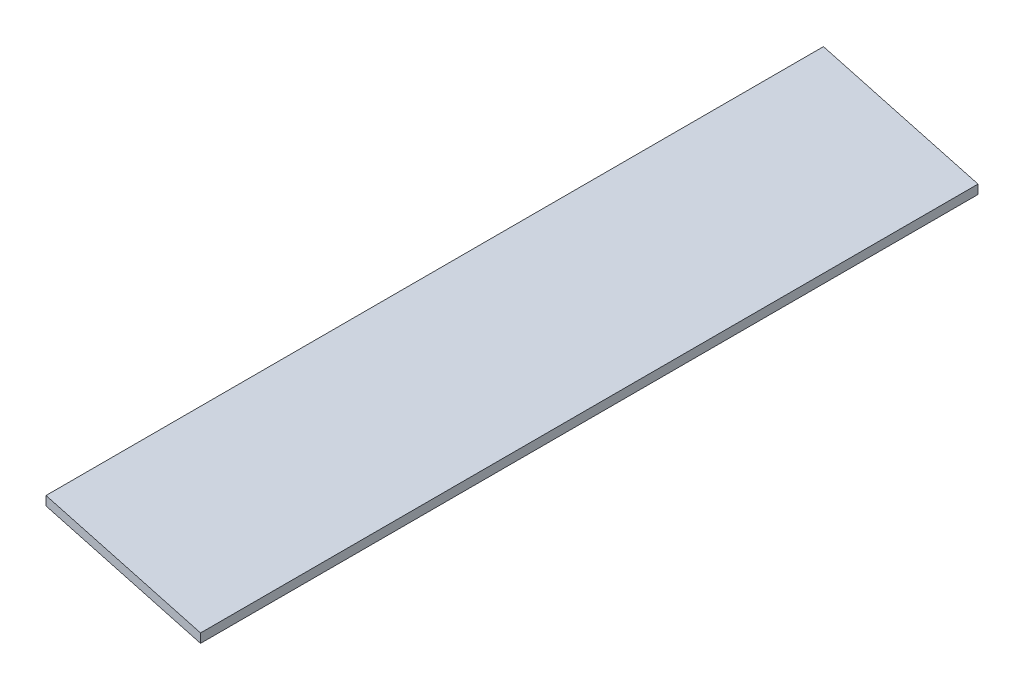
ISO-10303-21;
HEADER;
FILE_DESCRIPTION(('STEP AP214'),'2;1');
FILE_NAME('part.step','',(''),(''),'','','');
FILE_SCHEMA(('AUTOMOTIVE_DESIGN { 1 0 10303 214 1 1 1 1 }'));
ENDSEC;
DATA;
#1=APPLICATION_CONTEXT('core data for automotive mechanical design processes');
#2=APPLICATION_PROTOCOL_DEFINITION('international standard','automotive_design',2000,#1);
#3=PRODUCT_CONTEXT('',#1,'mechanical');
#4=PRODUCT('Part','Part','',(#3));
#5=PRODUCT_RELATED_PRODUCT_CATEGORY('part','',(#4));
#6=PRODUCT_DEFINITION_FORMATION('','',#4);
#7=PRODUCT_DEFINITION_CONTEXT('part definition',#1,'design');
#8=PRODUCT_DEFINITION('design','',#6,#7);
#9=PRODUCT_DEFINITION_SHAPE('','',#8);
#10=(LENGTH_UNIT() NAMED_UNIT(*) SI_UNIT(.MILLI.,.METRE.));
#11=(NAMED_UNIT(*) PLANE_ANGLE_UNIT() SI_UNIT($,.RADIAN.));
#12=(NAMED_UNIT(*) SI_UNIT($,.STERADIAN.) SOLID_ANGLE_UNIT());
#13=UNCERTAINTY_MEASURE_WITH_UNIT(LENGTH_MEASURE(1.E-05),#10,'distance_accuracy_value','');
#14=(GEOMETRIC_REPRESENTATION_CONTEXT(3) GLOBAL_UNCERTAINTY_ASSIGNED_CONTEXT((#13)) GLOBAL_UNIT_ASSIGNED_CONTEXT((#10,
#11,#12)) REPRESENTATION_CONTEXT('',''));
#15=CARTESIAN_POINT('',(0.,0.,0.));
#16=DIRECTION('',(0.,0.,1.));
#17=DIRECTION('',(1.,0.,0.));
#18=AXIS2_PLACEMENT_3D('',#15,#16,#17);
#19=CARTESIAN_POINT('',(-8.631267976045,2.15,0.));
#20=DIRECTION('',(0.,1.,0.));
#21=DIRECTION('',(0.,0.,1.));
#22=AXIS2_PLACEMENT_3D('',#19,#20,#21);
#23=PLANE('',#22);
#24=DIRECTION('',(-0.978119374932536,0.,-0.208044438477901));
#25=VECTOR('',#24,1.);
#26=CARTESIAN_POINT('',(-7.732346536976,2.15,-4.226272437417));
#27=LINE('',#26,#25);
#28=CARTESIAN_POINT('',(1.87710031867289,2.15,-2.18235834431049));
#29=VERTEX_POINT('',#28);
#30=CARTESIAN_POINT('',(1.66005915992088,2.15,-2.22852265426745));
#31=VERTEX_POINT('',#30);
#32=EDGE_CURVE('E79',#29,#31,#27,.T.);
#33=ORIENTED_EDGE('',*,*,#32,.F.);
#34=DIRECTION('',(0.,0.,-1.));
#35=VECTOR('',#34,1.);
#36=CARTESIAN_POINT('',(1.877100318673,2.15,0.));
#37=LINE('',#36,#35);
#38=CARTESIAN_POINT('',(1.87710031867286,2.15,-1.32280645369934));
#39=VERTEX_POINT('',#38);
#40=EDGE_CURVE('E55',#39,#29,#37,.T.);
#41=ORIENTED_EDGE('',*,*,#40,.F.);
#42=DIRECTION('',(0.978119374932536,0.,0.208044438477901));
#43=VECTOR('',#42,1.);
#44=CARTESIAN_POINT('',(-7.907258724832,2.15,-3.403924091524));
#45=LINE('',#44,#43);
#46=CARTESIAN_POINT('',(1.6600591599209,2.15,-1.36897076365554));
#47=VERTEX_POINT('',#46);
#48=EDGE_CURVE('E57',#47,#39,#45,.T.);
#49=ORIENTED_EDGE('',*,*,#48,.F.);
#50=DIRECTION('',(0.,0.,1.));
#51=VECTOR('',#50,1.);
#52=CARTESIAN_POINT('',(1.660059159921,2.15,0.));
#53=LINE('',#52,#51);
#54=EDGE_CURVE('E20',#31,#47,#53,.T.);
#55=ORIENTED_EDGE('',*,*,#54,.F.);
#56=EDGE_LOOP('',(#33,#41,#49,#55));
#57=FACE_BOUND('',#56,.T.);
#58=ADVANCED_FACE('F17',(#57),#23,.F.);
#59=CARTESIAN_POINT('',(1.660059159921,2.16,0.));
#60=DIRECTION('',(-1.,0.,0.));
#61=DIRECTION('',(0.,0.,1.));
#62=AXIS2_PLACEMENT_3D('',#59,#60,#61);
#63=PLANE('',#62);
#64=DIRECTION('',(0.,0.,1.));
#65=VECTOR('',#64,1.);
#66=CARTESIAN_POINT('',(1.660059159921,2.16,0.));
#67=LINE('',#66,#65);
#68=CARTESIAN_POINT('',(1.66005915992088,2.16,-2.22852265426745));
#69=VERTEX_POINT('',#68);
#70=CARTESIAN_POINT('',(1.6600591599209,2.16,-1.36897076365554));
#71=VERTEX_POINT('',#70);
#72=EDGE_CURVE('E83',#69,#71,#67,.T.);
#73=ORIENTED_EDGE('',*,*,#72,.F.);
#74=DIRECTION('',(0.,1.,0.));
#75=VECTOR('',#74,1.);
#76=CARTESIAN_POINT('',(1.66005915992053,2.16,-2.22852265426578));
#77=LINE('',#76,#75);
#78=EDGE_CURVE('E68',#31,#69,#77,.T.);
#79=ORIENTED_EDGE('',*,*,#78,.F.);
#80=ORIENTED_EDGE('',*,*,#54,.T.);
#81=DIRECTION('',(0.,1.,0.));
#82=VECTOR('',#81,1.);
#83=CARTESIAN_POINT('',(1.66005915992061,2.16,-1.36897076365415));
#84=LINE('',#83,#82);
#85=EDGE_CURVE('E63',#71,#47,#84,.F.);
#86=ORIENTED_EDGE('',*,*,#85,.F.);
#87=EDGE_LOOP('',(#73,#79,#80,#86));
#88=FACE_BOUND('',#87,.T.);
#89=ADVANCED_FACE('F65',(#88),#63,.T.);
#90=CARTESIAN_POINT('',(-7.907258724832,2.16,-3.403924091524));
#91=DIRECTION('',(-0.208044438477901,0.,0.978119374932536));
#92=DIRECTION('',(0.978119374932536,0.,0.208044438477901));
#93=AXIS2_PLACEMENT_3D('',#90,#91,#92);
#94=PLANE('',#93);
#95=DIRECTION('',(0.978119374933284,0.,0.208044438474383));
#96=VECTOR('',#95,1.);
#97=CARTESIAN_POINT('',(1.660059159921,2.16,-1.368970763656));
#98=LINE('',#97,#96);
#99=CARTESIAN_POINT('',(1.87710031867272,2.16,-1.32280645369869));
#100=VERTEX_POINT('',#99);
#101=EDGE_CURVE('E72',#71,#100,#98,.T.);
#102=ORIENTED_EDGE('',*,*,#101,.F.);
#103=ORIENTED_EDGE('',*,*,#85,.T.);
#104=ORIENTED_EDGE('',*,*,#48,.T.);
#105=DIRECTION('',(0.,1.,0.));
#106=VECTOR('',#105,1.);
#107=CARTESIAN_POINT('',(1.877100318673,2.16,-1.3228064537));
#108=LINE('',#107,#106);
#109=EDGE_CURVE('E75',#100,#39,#108,.F.);
#110=ORIENTED_EDGE('',*,*,#109,.F.);
#111=EDGE_LOOP('',(#102,#103,#104,#110));
#112=FACE_BOUND('',#111,.T.);
#113=ADVANCED_FACE('F70',(#112),#94,.T.);
#114=CARTESIAN_POINT('',(1.877100318673,2.16,0.));
#115=DIRECTION('',(1.,0.,0.));
#116=DIRECTION('',(0.,0.,-1.));
#117=AXIS2_PLACEMENT_3D('',#114,#115,#116);
#118=PLANE('',#117);
#119=DIRECTION('',(0.,0.,1.));
#120=VECTOR('',#119,1.);
#121=CARTESIAN_POINT('',(1.877100318673,2.16,0.));
#122=LINE('',#121,#120);
#123=CARTESIAN_POINT('',(1.87710031867289,2.16,-2.18235834431049));
#124=VERTEX_POINT('',#123);
#125=EDGE_CURVE('E26',#100,#124,#122,.F.);
#126=ORIENTED_EDGE('',*,*,#125,.F.);
#127=ORIENTED_EDGE('',*,*,#109,.T.);
#128=ORIENTED_EDGE('',*,*,#40,.T.);
#129=DIRECTION('',(0.,1.,0.));
#130=VECTOR('',#129,1.);
#131=CARTESIAN_POINT('',(1.87710031867257,2.16,-2.18235834430896));
#132=LINE('',#131,#130);
#133=EDGE_CURVE('E35',#124,#29,#132,.F.);
#134=ORIENTED_EDGE('',*,*,#133,.F.);
#135=EDGE_LOOP('',(#126,#127,#128,#134));
#136=FACE_BOUND('',#135,.T.);
#137=ADVANCED_FACE('F89',(#136),#118,.T.);
#138=CARTESIAN_POINT('',(-7.732346536976,2.16,-4.226272437417));
#139=DIRECTION('',(0.208044438477901,0.,-0.978119374932536));
#140=DIRECTION('',(-0.978119374932536,0.,-0.208044438477901));
#141=AXIS2_PLACEMENT_3D('',#138,#139,#140);
#142=PLANE('',#141);
#143=DIRECTION('',(-0.978119374932367,0.,-0.208044438478696));
#144=VECTOR('',#143,1.);
#145=CARTESIAN_POINT('',(1.877100318673,2.16,-2.182358344311));
#146=LINE('',#145,#144);
#147=EDGE_CURVE('E11',#124,#69,#146,.T.);
#148=ORIENTED_EDGE('',*,*,#147,.F.);
#149=ORIENTED_EDGE('',*,*,#133,.T.);
#150=ORIENTED_EDGE('',*,*,#32,.T.);
#151=ORIENTED_EDGE('',*,*,#78,.T.);
#152=EDGE_LOOP('',(#148,#149,#150,#151));
#153=FACE_BOUND('',#152,.T.);
#154=ADVANCED_FACE('F91',(#153),#142,.T.);
#155=CARTESIAN_POINT('',(-8.631267976045,2.16,0.));
#156=DIRECTION('',(0.,1.,0.));
#157=DIRECTION('',(0.,0.,1.));
#158=AXIS2_PLACEMENT_3D('',#155,#156,#157);
#159=PLANE('',#158);
#160=ORIENTED_EDGE('',*,*,#125,.T.);
#161=ORIENTED_EDGE('',*,*,#147,.T.);
#162=ORIENTED_EDGE('',*,*,#72,.T.);
#163=ORIENTED_EDGE('',*,*,#101,.T.);
#164=EDGE_LOOP('',(#160,#161,#162,#163));
#165=FACE_BOUND('',#164,.T.);
#166=ADVANCED_FACE('F88',(#165),#159,.T.);
#167=CLOSED_SHELL('',(#58,#89,#113,#137,#154,#166));
#168=MANIFOLD_SOLID_BREP('B1',#167);
#169=ADVANCED_BREP_SHAPE_REPRESENTATION('',(#18,#168),#14);
#170=SHAPE_DEFINITION_REPRESENTATION(#9,#169);
ENDSEC;
END-ISO-10303-21;
